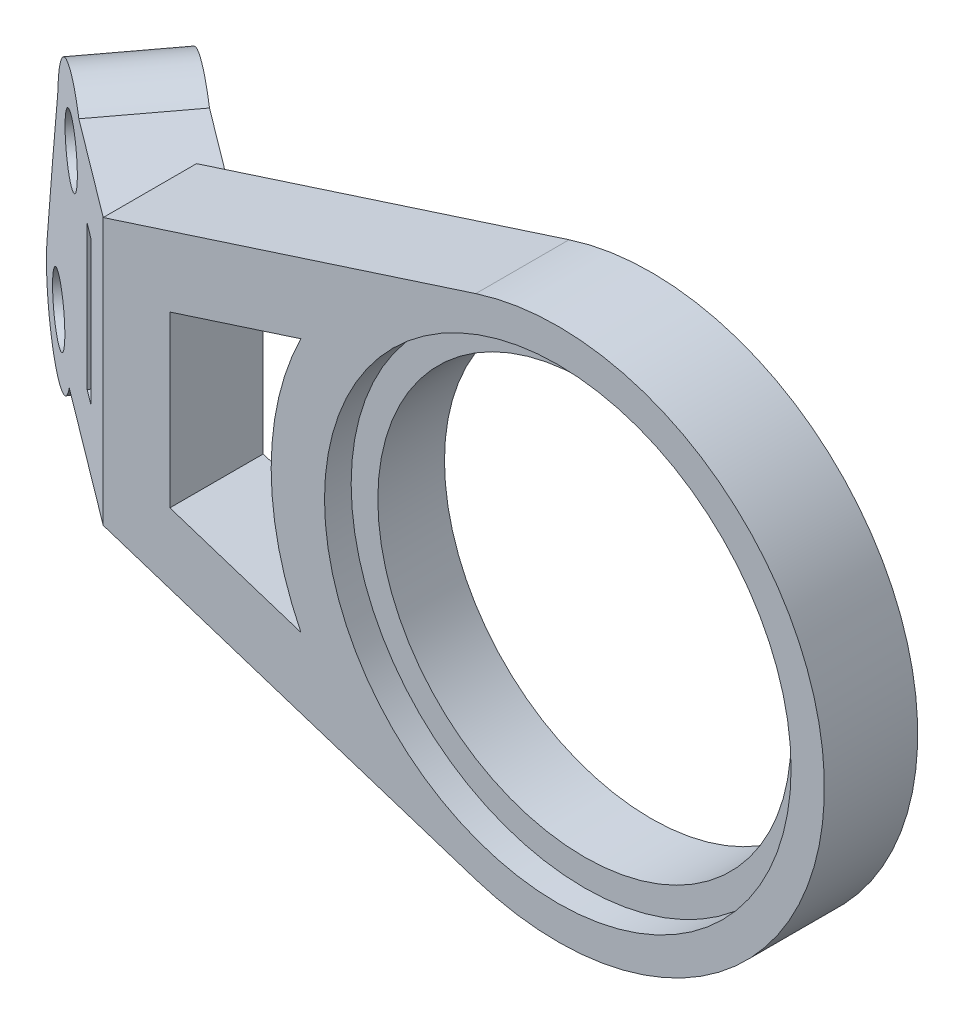
ISO-10303-21;
HEADER;
FILE_DESCRIPTION(('STEP AP214'),'2;1');
FILE_NAME('part.step','',(''),(''),'','','');
FILE_SCHEMA(('AUTOMOTIVE_DESIGN { 1 0 10303 214 1 1 1 1 }'));
ENDSEC;
DATA;
#1=APPLICATION_CONTEXT('core data for automotive mechanical design processes');
#2=APPLICATION_PROTOCOL_DEFINITION('international standard','automotive_design',2000,#1);
#3=PRODUCT_CONTEXT('',#1,'mechanical');
#4=PRODUCT('Part','Part','',(#3));
#5=PRODUCT_RELATED_PRODUCT_CATEGORY('part','',(#4));
#6=PRODUCT_DEFINITION_FORMATION('','',#4);
#7=PRODUCT_DEFINITION_CONTEXT('part definition',#1,'design');
#8=PRODUCT_DEFINITION('design','',#6,#7);
#9=PRODUCT_DEFINITION_SHAPE('','',#8);
#10=(LENGTH_UNIT() NAMED_UNIT(*) SI_UNIT(.MILLI.,.METRE.));
#11=(NAMED_UNIT(*) PLANE_ANGLE_UNIT() SI_UNIT($,.RADIAN.));
#12=(NAMED_UNIT(*) SI_UNIT($,.STERADIAN.) SOLID_ANGLE_UNIT());
#13=UNCERTAINTY_MEASURE_WITH_UNIT(LENGTH_MEASURE(1.E-05),#10,'distance_accuracy_value','');
#14=(GEOMETRIC_REPRESENTATION_CONTEXT(3) GLOBAL_UNCERTAINTY_ASSIGNED_CONTEXT((#13)) GLOBAL_UNIT_ASSIGNED_CONTEXT((#10,
#11,#12)) REPRESENTATION_CONTEXT('',''));
#15=CARTESIAN_POINT('',(0.,0.,0.));
#16=DIRECTION('',(0.,0.,1.));
#17=DIRECTION('',(1.,0.,0.));
#18=AXIS2_PLACEMENT_3D('',#15,#16,#17);
#19=CARTESIAN_POINT('',(0.,-5.,0.));
#20=DIRECTION('',(0.,-1.,0.));
#21=DIRECTION('',(0.,0.,-1.));
#22=AXIS2_PLACEMENT_3D('',#19,#20,#21);
#23=PLANE('',#22);
#24=DIRECTION('',(0.799799289354779,0.,0.600267520983429));
#25=VECTOR('',#24,1.);
#26=CARTESIAN_POINT('',(-17.0487651334141,-5.,3.5));
#27=LINE('',#26,#25);
#28=CARTESIAN_POINT('',(-22.1503316115981,-5.,-0.328841440284535));
#29=VERTEX_POINT('',#28);
#30=CARTESIAN_POINT('',(-17.0487651334141,-5.,3.5));
#31=VERTEX_POINT('',#30);
#32=EDGE_CURVE('E237',#29,#31,#27,.T.);
#33=ORIENTED_EDGE('',*,*,#32,.F.);
#34=DIRECTION('',(-0.600267520983429,0.,0.799799289354779));
#35=VECTOR('',#34,1.);
#36=CARTESIAN_POINT('',(-20.0493952881561,-5.,-3.12813895302626));
#37=LINE('',#36,#35);
#38=CARTESIAN_POINT('',(-20.0493952881561,-5.,-3.12813895302626));
#39=VERTEX_POINT('',#38);
#40=EDGE_CURVE('E180',#39,#29,#37,.T.);
#41=ORIENTED_EDGE('',*,*,#40,.F.);
#42=DIRECTION('',(-0.799799289354779,0.,-0.600267520983429));
#43=VECTOR('',#42,1.);
#44=CARTESIAN_POINT('',(-15.8814481243072,-5.,0.));
#45=LINE('',#44,#43);
#46=CARTESIAN_POINT('',(-15.8814481243072,-5.,0.));
#47=VERTEX_POINT('',#46);
#48=EDGE_CURVE('E234',#47,#39,#45,.T.);
#49=ORIENTED_EDGE('',*,*,#48,.F.);
#50=DIRECTION('',(-1.,0.,0.));
#51=VECTOR('',#50,1.);
#52=CARTESIAN_POINT('',(0.,-5.,0.));
#53=LINE('',#52,#51);
#54=CARTESIAN_POINT('',(-17.0487651334141,-5.,0.));
#55=VERTEX_POINT('',#54);
#56=EDGE_CURVE('E244',#47,#55,#53,.T.);
#57=ORIENTED_EDGE('',*,*,#56,.T.);
#58=DIRECTION('',(0.,0.,-1.));
#59=VECTOR('',#58,1.);
#60=CARTESIAN_POINT('',(-17.0487651334141,-5.,3.5));
#61=LINE('',#60,#59);
#62=EDGE_CURVE('E311',#31,#55,#61,.T.);
#63=ORIENTED_EDGE('',*,*,#62,.F.);
#64=EDGE_LOOP('',(#33,#41,#49,#57,#63));
#65=FACE_BOUND('',#64,.T.);
#66=ADVANCED_FACE('F32',(#65),#23,.T.);
#67=CARTESIAN_POINT('',(0.,0.,0.));
#68=DIRECTION('',(0.,0.,-1.));
#69=DIRECTION('',(-1.,0.,0.));
#70=AXIS2_PLACEMENT_3D('',#67,#68,#69);
#71=PLANE('',#70);
#72=CARTESIAN_POINT('',(0.,0.,0.));
#73=DIRECTION('',(0.,0.,1.));
#74=DIRECTION('',(1.,0.,0.));
#75=AXIS2_PLACEMENT_3D('',#72,#73,#74);
#76=CIRCLE('',#75,7.75);
#77=CARTESIAN_POINT('',(7.75,0.,0.));
#78=VERTEX_POINT('',#77);
#79=EDGE_CURVE('E286',#78,#78,#76,.T.);
#80=ORIENTED_EDGE('',*,*,#79,.T.);
#81=EDGE_LOOP('',(#80));
#82=FACE_BOUND('',#81,.T.);
#83=CARTESIAN_POINT('',(0.,0.,0.));
#84=DIRECTION('',(0.,0.,-1.));
#85=DIRECTION('',(1.,0.,0.));
#86=AXIS2_PLACEMENT_3D('',#83,#84,#85);
#87=CIRCLE('',#86,10.75);
#88=CARTESIAN_POINT('',(-9.63448380999815,-4.76856600194267,0.));
#89=VERTEX_POINT('',#88);
#90=CARTESIAN_POINT('',(-9.63448380999815,4.76856600194267,0.));
#91=VERTEX_POINT('',#90);
#92=EDGE_CURVE('E258',#89,#91,#87,.T.);
#93=ORIENTED_EDGE('',*,*,#92,.T.);
#94=DIRECTION('',(-0.951553015663071,-0.307484728698052,0.));
#95=VECTOR('',#94,1.);
#96=CARTESIAN_POINT('',(-9.63448380999815,4.76856600194266,0.));
#97=LINE('',#96,#95);
#98=CARTESIAN_POINT('',(-14.5487651334141,3.18056571756177,0.));
#99=VERTEX_POINT('',#98);
#100=EDGE_CURVE('E266',#91,#99,#97,.T.);
#101=ORIENTED_EDGE('',*,*,#100,.T.);
#102=DIRECTION('',(0.,-1.,0.));
#103=VECTOR('',#102,1.);
#104=CARTESIAN_POINT('',(-14.5487651334141,3.18056571756177,0.));
#105=LINE('',#104,#103);
#106=CARTESIAN_POINT('',(-14.5487651334141,-3.18056571756177,0.));
#107=VERTEX_POINT('',#106);
#108=EDGE_CURVE('E269',#99,#107,#105,.T.);
#109=ORIENTED_EDGE('',*,*,#108,.T.);
#110=DIRECTION('',(0.951553015663071,-0.307484728698052,0.));
#111=VECTOR('',#110,1.);
#112=CARTESIAN_POINT('',(-14.5487651334141,-3.18056571756177,0.));
#113=LINE('',#112,#111);
#114=EDGE_CURVE('E272',#107,#89,#113,.T.);
#115=ORIENTED_EDGE('',*,*,#114,.T.);
#116=EDGE_LOOP('',(#93,#101,#109,#115));
#117=FACE_BOUND('',#116,.T.);
#118=DIRECTION('',(0.,-1.,0.));
#119=VECTOR('',#118,1.);
#120=CARTESIAN_POINT('',(-15.8814481243072,5.,0.));
#121=LINE('',#120,#119);
#122=CARTESIAN_POINT('',(-15.8814481243072,5.,0.));
#123=VERTEX_POINT('',#122);
#124=EDGE_CURVE('E239',#123,#47,#121,.T.);
#125=ORIENTED_EDGE('',*,*,#124,.F.);
#126=DIRECTION('',(-1.,0.,0.));
#127=VECTOR('',#126,1.);
#128=CARTESIAN_POINT('',(0.,5.,0.));
#129=LINE('',#128,#127);
#130=CARTESIAN_POINT('',(-17.0487651334141,5.,0.));
#131=VERTEX_POINT('',#130);
#132=EDGE_CURVE('E246',#123,#131,#129,.T.);
#133=ORIENTED_EDGE('',*,*,#132,.T.);
#134=DIRECTION('',(-0.951553015663071,-0.307484728698053,0.));
#135=VECTOR('',#134,1.);
#136=CARTESIAN_POINT('',(-3.07484728698053,9.51553015663071,0.));
#137=LINE('',#136,#135);
#138=CARTESIAN_POINT('',(-3.07484728698053,9.51553015663071,0.));
#139=VERTEX_POINT('',#138);
#140=EDGE_CURVE('E305',#139,#131,#137,.T.);
#141=ORIENTED_EDGE('',*,*,#140,.F.);
#142=CARTESIAN_POINT('',(0.,0.,0.));
#143=DIRECTION('',(0.,0.,1.));
#144=DIRECTION('',(-1.,0.,0.));
#145=AXIS2_PLACEMENT_3D('',#142,#143,#144);
#146=CIRCLE('',#145,10.);
#147=CARTESIAN_POINT('',(-3.07484728698053,-9.51553015663071,0.));
#148=VERTEX_POINT('',#147);
#149=EDGE_CURVE('E289',#148,#139,#146,.T.);
#150=ORIENTED_EDGE('',*,*,#149,.F.);
#151=DIRECTION('',(0.951553015663071,-0.307484728698053,0.));
#152=VECTOR('',#151,1.);
#153=CARTESIAN_POINT('',(-3.07484728698053,-9.51553015663071,0.));
#154=LINE('',#153,#152);
#155=EDGE_CURVE('E294',#55,#148,#154,.T.);
#156=ORIENTED_EDGE('',*,*,#155,.F.);
#157=ORIENTED_EDGE('',*,*,#56,.F.);
#158=EDGE_LOOP('',(#125,#133,#141,#150,#156,#157));
#159=FACE_BOUND('',#158,.T.);
#160=ADVANCED_FACE('F320',(#82,#117,#159),#71,.T.);
#161=CARTESIAN_POINT('',(0.,0.,3.5));
#162=DIRECTION('',(0.,0.,-1.));
#163=DIRECTION('',(-1.,0.,0.));
#164=AXIS2_PLACEMENT_3D('',#161,#162,#163);
#165=CYLINDRICAL_SURFACE('',#164,7.75);
#166=ORIENTED_EDGE('',*,*,#79,.F.);
#167=EDGE_LOOP('',(#166));
#168=FACE_BOUND('',#167,.T.);
#169=CARTESIAN_POINT('',(0.,0.,2.5));
#170=DIRECTION('',(0.,0.,1.));
#171=DIRECTION('',(1.,0.,0.));
#172=AXIS2_PLACEMENT_3D('',#169,#170,#171);
#173=CIRCLE('',#172,7.75);
#174=CARTESIAN_POINT('',(7.75,0.,2.5));
#175=VERTEX_POINT('',#174);
#176=EDGE_CURVE('E36',#175,#175,#173,.T.);
#177=ORIENTED_EDGE('',*,*,#176,.T.);
#178=EDGE_LOOP('',(#177));
#179=FACE_BOUND('',#178,.T.);
#180=ADVANCED_FACE('F377',(#168,#179),#165,.F.);
#181=CARTESIAN_POINT('',(0.,0.,3.5));
#182=DIRECTION('',(0.,0.,-1.));
#183=DIRECTION('',(-1.,0.,0.));
#184=AXIS2_PLACEMENT_3D('',#181,#182,#183);
#185=PLANE('',#184);
#186=CARTESIAN_POINT('',(0.,0.,3.5));
#187=DIRECTION('',(0.,0.,1.));
#188=DIRECTION('',(1.,0.,0.));
#189=AXIS2_PLACEMENT_3D('',#186,#187,#188);
#190=CIRCLE('',#189,8.75);
#191=CARTESIAN_POINT('',(8.75,0.,3.5));
#192=VERTEX_POINT('',#191);
#193=EDGE_CURVE('E249',#192,#192,#190,.T.);
#194=ORIENTED_EDGE('',*,*,#193,.F.);
#195=EDGE_LOOP('',(#194));
#196=FACE_BOUND('',#195,.T.);
#197=CARTESIAN_POINT('',(0.,0.,3.5));
#198=DIRECTION('',(0.,0.,1.));
#199=DIRECTION('',(-1.,0.,0.));
#200=AXIS2_PLACEMENT_3D('',#197,#198,#199);
#201=CIRCLE('',#200,10.);
#202=CARTESIAN_POINT('',(-3.07484728698053,-9.51553015663071,3.5));
#203=VERTEX_POINT('',#202);
#204=CARTESIAN_POINT('',(-3.07484728698053,9.51553015663071,3.5));
#205=VERTEX_POINT('',#204);
#206=EDGE_CURVE('E290',#203,#205,#201,.T.);
#207=ORIENTED_EDGE('',*,*,#206,.T.);
#208=DIRECTION('',(-0.951553015663071,-0.307484728698053,0.));
#209=VECTOR('',#208,1.);
#210=CARTESIAN_POINT('',(-3.07484728698053,9.51553015663071,3.5));
#211=LINE('',#210,#209);
#212=CARTESIAN_POINT('',(-17.0487651334141,5.,3.5));
#213=VERTEX_POINT('',#212);
#214=EDGE_CURVE('E293',#205,#213,#211,.T.);
#215=ORIENTED_EDGE('',*,*,#214,.T.);
#216=DIRECTION('',(0.,-1.,0.));
#217=VECTOR('',#216,1.);
#218=CARTESIAN_POINT('',(-17.0487651334141,5.,3.5));
#219=LINE('',#218,#217);
#220=EDGE_CURVE('E297',#213,#31,#219,.T.);
#221=ORIENTED_EDGE('',*,*,#220,.T.);
#222=DIRECTION('',(0.951553015663071,-0.307484728698053,0.));
#223=VECTOR('',#222,1.);
#224=CARTESIAN_POINT('',(-3.07484728698053,-9.51553015663071,3.5));
#225=LINE('',#224,#223);
#226=EDGE_CURVE('E300',#31,#203,#225,.T.);
#227=ORIENTED_EDGE('',*,*,#226,.T.);
#228=EDGE_LOOP('',(#207,#215,#221,#227));
#229=FACE_BOUND('',#228,.T.);
#230=DIRECTION('',(-0.951553015663071,-0.307484728698052,0.));
#231=VECTOR('',#230,1.);
#232=CARTESIAN_POINT('',(-9.63448380999815,4.76856600194266,3.5));
#233=LINE('',#232,#231);
#234=CARTESIAN_POINT('',(-9.63448380999815,4.76856600194267,3.5));
#235=VERTEX_POINT('',#234);
#236=CARTESIAN_POINT('',(-14.5487651334141,3.18056571756177,3.5));
#237=VERTEX_POINT('',#236);
#238=EDGE_CURVE('E255',#235,#237,#233,.T.);
#239=ORIENTED_EDGE('',*,*,#238,.F.);
#240=CARTESIAN_POINT('',(0.,0.,3.5));
#241=DIRECTION('',(0.,0.,-1.));
#242=DIRECTION('',(1.,0.,0.));
#243=AXIS2_PLACEMENT_3D('',#240,#241,#242);
#244=CIRCLE('',#243,10.75);
#245=CARTESIAN_POINT('',(-9.63448380999815,-4.76856600194267,3.5));
#246=VERTEX_POINT('',#245);
#247=EDGE_CURVE('E263',#246,#235,#244,.T.);
#248=ORIENTED_EDGE('',*,*,#247,.F.);
#249=DIRECTION('',(0.951553015663071,-0.307484728698052,0.));
#250=VECTOR('',#249,1.);
#251=CARTESIAN_POINT('',(-14.5487651334141,-3.18056571756177,3.5));
#252=LINE('',#251,#250);
#253=CARTESIAN_POINT('',(-14.5487651334141,-3.18056571756177,3.5));
#254=VERTEX_POINT('',#253);
#255=EDGE_CURVE('E260',#254,#246,#252,.T.);
#256=ORIENTED_EDGE('',*,*,#255,.F.);
#257=DIRECTION('',(0.,-1.,0.));
#258=VECTOR('',#257,1.);
#259=CARTESIAN_POINT('',(-14.5487651334141,3.18056571756177,3.5));
#260=LINE('',#259,#258);
#261=EDGE_CURVE('E257',#237,#254,#260,.T.);
#262=ORIENTED_EDGE('',*,*,#261,.F.);
#263=EDGE_LOOP('',(#239,#248,#256,#262));
#264=FACE_BOUND('',#263,.T.);
#265=ADVANCED_FACE('F337',(#196,#229,#264),#185,.F.);
#266=CARTESIAN_POINT('',(0.,0.,3.5));
#267=DIRECTION('',(0.,0.,-1.));
#268=DIRECTION('',(-1.,0.,0.));
#269=AXIS2_PLACEMENT_3D('',#266,#267,#268);
#270=CYLINDRICAL_SURFACE('',#269,10.);
#271=ORIENTED_EDGE('',*,*,#149,.T.);
#272=DIRECTION('',(0.,0.,-1.));
#273=VECTOR('',#272,1.);
#274=CARTESIAN_POINT('',(-3.07484728698053,9.51553015663071,3.5));
#275=LINE('',#274,#273);
#276=EDGE_CURVE('E11',#205,#139,#275,.T.);
#277=ORIENTED_EDGE('',*,*,#276,.F.);
#278=ORIENTED_EDGE('',*,*,#206,.F.);
#279=DIRECTION('',(0.,0.,-1.));
#280=VECTOR('',#279,1.);
#281=CARTESIAN_POINT('',(-3.07484728698053,-9.51553015663071,3.5));
#282=LINE('',#281,#280);
#283=EDGE_CURVE('E302',#203,#148,#282,.T.);
#284=ORIENTED_EDGE('',*,*,#283,.T.);
#285=EDGE_LOOP('',(#271,#277,#278,#284));
#286=FACE_BOUND('',#285,.T.);
#287=ADVANCED_FACE('F34',(#286),#270,.T.);
#288=CARTESIAN_POINT('',(-3.07484728698053,9.51553015663071,3.5));
#289=DIRECTION('',(0.307484728698053,-0.951553015663071,0.));
#290=DIRECTION('',(0.951553015663071,0.307484728698053,0.));
#291=AXIS2_PLACEMENT_3D('',#288,#289,#290);
#292=PLANE('',#291);
#293=ORIENTED_EDGE('',*,*,#140,.T.);
#294=DIRECTION('',(0.,0.,-1.));
#295=VECTOR('',#294,1.);
#296=CARTESIAN_POINT('',(-17.0487651334141,5.,3.5));
#297=LINE('',#296,#295);
#298=EDGE_CURVE('E41',#213,#131,#297,.T.);
#299=ORIENTED_EDGE('',*,*,#298,.F.);
#300=ORIENTED_EDGE('',*,*,#214,.F.);
#301=ORIENTED_EDGE('',*,*,#276,.T.);
#302=EDGE_LOOP('',(#293,#299,#300,#301));
#303=FACE_BOUND('',#302,.T.);
#304=ADVANCED_FACE('F323',(#303),#292,.F.);
#305=CARTESIAN_POINT('',(-3.07484728698053,-9.51553015663071,3.5));
#306=DIRECTION('',(0.307484728698053,0.951553015663071,0.));
#307=DIRECTION('',(-0.951553015663071,0.307484728698053,0.));
#308=AXIS2_PLACEMENT_3D('',#305,#306,#307);
#309=PLANE('',#308);
#310=ORIENTED_EDGE('',*,*,#155,.T.);
#311=ORIENTED_EDGE('',*,*,#283,.F.);
#312=ORIENTED_EDGE('',*,*,#226,.F.);
#313=ORIENTED_EDGE('',*,*,#62,.T.);
#314=EDGE_LOOP('',(#310,#311,#312,#313));
#315=FACE_BOUND('',#314,.T.);
#316=ADVANCED_FACE('F330',(#315),#309,.F.);
#317=CARTESIAN_POINT('',(-9.63448380999815,4.76856600194266,3.5));
#318=DIRECTION('',(0.307484728698052,-0.951553015663071,0.));
#319=DIRECTION('',(0.951553015663071,0.307484728698052,0.));
#320=AXIS2_PLACEMENT_3D('',#317,#318,#319);
#321=PLANE('',#320);
#322=ORIENTED_EDGE('',*,*,#100,.F.);
#323=DIRECTION('',(0.,0.,-1.));
#324=VECTOR('',#323,1.);
#325=CARTESIAN_POINT('',(-9.63448380999815,4.76856600194267,3.5));
#326=LINE('',#325,#324);
#327=EDGE_CURVE('E265',#235,#91,#326,.T.);
#328=ORIENTED_EDGE('',*,*,#327,.F.);
#329=ORIENTED_EDGE('',*,*,#238,.T.);
#330=DIRECTION('',(0.,0.,-1.));
#331=VECTOR('',#330,1.);
#332=CARTESIAN_POINT('',(-14.5487651334141,3.18056571756177,3.5));
#333=LINE('',#332,#331);
#334=EDGE_CURVE('E283',#237,#99,#333,.T.);
#335=ORIENTED_EDGE('',*,*,#334,.T.);
#336=EDGE_LOOP('',(#322,#328,#329,#335));
#337=FACE_BOUND('',#336,.T.);
#338=ADVANCED_FACE('F407',(#337),#321,.T.);
#339=CARTESIAN_POINT('',(-14.5487651334141,3.18056571756177,3.5));
#340=DIRECTION('',(1.,0.,0.));
#341=DIRECTION('',(0.,0.,-1.));
#342=AXIS2_PLACEMENT_3D('',#339,#340,#341);
#343=PLANE('',#342);
#344=ORIENTED_EDGE('',*,*,#108,.F.);
#345=ORIENTED_EDGE('',*,*,#334,.F.);
#346=ORIENTED_EDGE('',*,*,#261,.T.);
#347=DIRECTION('',(0.,0.,-1.));
#348=VECTOR('',#347,1.);
#349=CARTESIAN_POINT('',(-14.5487651334141,-3.18056571756177,3.5));
#350=LINE('',#349,#348);
#351=EDGE_CURVE('E281',#254,#107,#350,.T.);
#352=ORIENTED_EDGE('',*,*,#351,.T.);
#353=EDGE_LOOP('',(#344,#345,#346,#352));
#354=FACE_BOUND('',#353,.T.);
#355=ADVANCED_FACE('F403',(#354),#343,.T.);
#356=CARTESIAN_POINT('',(-14.5487651334141,-3.18056571756177,3.5));
#357=DIRECTION('',(0.307484728698053,0.951553015663071,0.));
#358=DIRECTION('',(-0.951553015663071,0.307484728698053,0.));
#359=AXIS2_PLACEMENT_3D('',#356,#357,#358);
#360=PLANE('',#359);
#361=ORIENTED_EDGE('',*,*,#114,.F.);
#362=ORIENTED_EDGE('',*,*,#351,.F.);
#363=ORIENTED_EDGE('',*,*,#255,.T.);
#364=DIRECTION('',(0.,0.,-1.));
#365=VECTOR('',#364,1.);
#366=CARTESIAN_POINT('',(-9.63448380999815,-4.76856600194267,3.5));
#367=LINE('',#366,#365);
#368=EDGE_CURVE('E279',#246,#89,#367,.T.);
#369=ORIENTED_EDGE('',*,*,#368,.T.);
#370=EDGE_LOOP('',(#361,#362,#363,#369));
#371=FACE_BOUND('',#370,.T.);
#372=ADVANCED_FACE('F399',(#371),#360,.T.);
#373=CARTESIAN_POINT('',(0.,0.,3.5));
#374=DIRECTION('',(0.,0.,-1.));
#375=DIRECTION('',(-1.,0.,0.));
#376=AXIS2_PLACEMENT_3D('',#373,#374,#375);
#377=CYLINDRICAL_SURFACE('',#376,10.75);
#378=ORIENTED_EDGE('',*,*,#92,.F.);
#379=ORIENTED_EDGE('',*,*,#368,.F.);
#380=ORIENTED_EDGE('',*,*,#247,.T.);
#381=ORIENTED_EDGE('',*,*,#327,.T.);
#382=EDGE_LOOP('',(#378,#379,#380,#381));
#383=FACE_BOUND('',#382,.T.);
#384=ADVANCED_FACE('F395',(#383),#377,.T.);
#385=CARTESIAN_POINT('',(0.,0.,2.5));
#386=DIRECTION('',(0.,0.,1.));
#387=DIRECTION('',(1.,0.,0.));
#388=AXIS2_PLACEMENT_3D('',#385,#386,#387);
#389=CYLINDRICAL_SURFACE('',#388,8.75);
#390=CARTESIAN_POINT('',(0.,0.,2.5));
#391=DIRECTION('',(0.,0.,1.));
#392=DIRECTION('',(1.,0.,0.));
#393=AXIS2_PLACEMENT_3D('',#390,#391,#392);
#394=CIRCLE('',#393,8.75);
#395=CARTESIAN_POINT('',(8.75,0.,2.5));
#396=VERTEX_POINT('',#395);
#397=EDGE_CURVE('E250',#396,#396,#394,.T.);
#398=ORIENTED_EDGE('',*,*,#397,.F.);
#399=EDGE_LOOP('',(#398));
#400=FACE_BOUND('',#399,.T.);
#401=ORIENTED_EDGE('',*,*,#193,.T.);
#402=EDGE_LOOP('',(#401));
#403=FACE_BOUND('',#402,.T.);
#404=ADVANCED_FACE('F391',(#400,#403),#389,.F.);
#405=CARTESIAN_POINT('',(0.,0.,2.5));
#406=DIRECTION('',(0.,0.,1.));
#407=DIRECTION('',(1.,0.,0.));
#408=AXIS2_PLACEMENT_3D('',#405,#406,#407);
#409=PLANE('',#408);
#410=ORIENTED_EDGE('',*,*,#176,.F.);
#411=EDGE_LOOP('',(#410));
#412=FACE_BOUND('',#411,.T.);
#413=ORIENTED_EDGE('',*,*,#397,.T.);
#414=EDGE_LOOP('',(#413));
#415=FACE_BOUND('',#414,.T.);
#416=ADVANCED_FACE('F388',(#412,#415),#409,.T.);
#417=CARTESIAN_POINT('',(-15.8814481243072,5.,0.));
#418=DIRECTION('',(-0.600267520983429,0.,0.799799289354779));
#419=DIRECTION('',(0.799799289354779,0.,0.600267520983429));
#420=AXIS2_PLACEMENT_3D('',#417,#418,#419);
#421=PLANE('',#420);
#422=CARTESIAN_POINT('',(-21.642482243929,-3.85,-4.32378687417455));
#423=DIRECTION('',(-0.600267520983429,0.,0.799799289354779));
#424=DIRECTION('',(0.799799289354779,0.,0.600267520983429));
#425=AXIS2_PLACEMENT_3D('',#422,#423,#424);
#426=CIRCLE('',#425,1.15);
#427=CARTESIAN_POINT('',(-20.722713061171,-3.85,-3.63347922504361));
#428=VERTEX_POINT('',#427);
#429=EDGE_CURVE('E196',#428,#428,#426,.T.);
#430=ORIENTED_EDGE('',*,*,#429,.T.);
#431=EDGE_LOOP('',(#430));
#432=FACE_BOUND('',#431,.T.);
#433=CARTESIAN_POINT('',(-19.7629539139453,2.95569614367259,-2.91315819986349));
#434=DIRECTION('',(-0.600267520983429,0.,0.799799289354779));
#435=DIRECTION('',(0.799799289354779,0.,0.600267520983429));
#436=AXIS2_PLACEMENT_3D('',#433,#434,#435);
#437=CIRCLE('',#436,1.14999999999999);
#438=CARTESIAN_POINT('',(-18.8431847311873,2.95569614367259,-2.22285055073255));
#439=VERTEX_POINT('',#438);
#440=EDGE_CURVE('E351',#439,#439,#437,.T.);
#441=ORIENTED_EDGE('',*,*,#440,.T.);
#442=EDGE_LOOP('',(#441));
#443=FACE_BOUND('',#442,.T.);
#444=DIRECTION('',(0.254846678052839,0.947876384359618,0.19126821654099));
#445=VECTOR('',#444,1.);
#446=CARTESIAN_POINT('',(-22.5622514266871,0.159821910403786,-5.01409452330543));
#447=LINE('',#446,#445);
#448=CARTESIAN_POINT('',(-22.5622514266871,0.159821910403786,-5.01409452330543));
#449=VERTEX_POINT('',#448);
#450=CARTESIAN_POINT('',(-21.7558101411383,3.15929852035892,-4.40884203341443));
#451=VERTEX_POINT('',#450);
#452=EDGE_CURVE('E159',#449,#451,#447,.T.);
#453=ORIENTED_EDGE('',*,*,#452,.T.);
#454=CARTESIAN_POINT('',(-19.7629539139453,2.95569614367259,-2.91315819986343));
#455=DIRECTION('',(-0.600267520983429,0.,0.799799289354779));
#456=DIRECTION('',(0.799799289354779,0.,0.600267520983429));
#457=AXIS2_PLACEMENT_3D('',#454,#455,#456);
#458=CIRCLE('',#457,2.5);
#459=CARTESIAN_POINT('',(-18.6120147403151,5.,-2.04935222534822));
#460=VERTEX_POINT('',#459);
#461=EDGE_CURVE('E187',#460,#451,#458,.T.);
#462=ORIENTED_EDGE('',*,*,#461,.F.);
#463=DIRECTION('',(-0.799799289354779,0.,-0.600267520983429));
#464=VECTOR('',#463,1.);
#465=CARTESIAN_POINT('',(-15.8814481243072,5.,0.));
#466=LINE('',#465,#464);
#467=EDGE_CURVE('E48',#123,#460,#466,.T.);
#468=ORIENTED_EDGE('',*,*,#467,.F.);
#469=ORIENTED_EDGE('',*,*,#124,.T.);
#470=ORIENTED_EDGE('',*,*,#48,.T.);
#471=CARTESIAN_POINT('',(-21.6424822439291,-3.85,-4.32378687417449));
#472=DIRECTION('',(0.600267520983429,0.,-0.799799289354779));
#473=DIRECTION('',(-0.799799289354779,0.,-0.600267520983429));
#474=AXIS2_PLACEMENT_3D('',#471,#472,#473);
#475=CIRCLE('',#474,2.3);
#476=CARTESIAN_POINT('',(-23.3972863012814,-3.15998528187295,-5.64080715080954));
#477=VERTEX_POINT('',#476);
#478=EDGE_CURVE('E185',#39,#477,#475,.T.);
#479=ORIENTED_EDGE('',*,*,#478,.T.);
#480=DIRECTION('',(-0.239944904870587,-0.953937188942567,-0.180084097518349));
#481=VECTOR('',#480,1.);
#482=CARTESIAN_POINT('',(-21.6703496284588,3.70571214163678,-4.34470197881457));
#483=LINE('',#482,#481);
#484=EDGE_CURVE('E176',#449,#477,#483,.T.);
#485=ORIENTED_EDGE('',*,*,#484,.F.);
#486=EDGE_LOOP('',(#453,#462,#468,#469,#470,#479,#485));
#487=FACE_BOUND('',#486,.T.);
#488=DIRECTION('',(-0.799799289354779,0.,-0.600267520983429));
#489=VECTOR('',#488,1.);
#490=CARTESIAN_POINT('',(-15.8814481243072,2.7,0.));
#491=LINE('',#490,#489);
#492=CARTESIAN_POINT('',(-16.787367175488,2.7,-0.679912811003675));
#493=VERTEX_POINT('',#492);
#494=CARTESIAN_POINT('',(-17.363556045881,2.7,-1.11235563691321));
#495=VERTEX_POINT('',#494);
#496=EDGE_CURVE('E228',#493,#495,#491,.T.);
#497=ORIENTED_EDGE('',*,*,#496,.T.);
#498=DIRECTION('',(0.,-1.,0.));
#499=VECTOR('',#498,1.);
#500=CARTESIAN_POINT('',(-17.363556045881,5.,-1.11235563691321));
#501=LINE('',#500,#499);
#502=CARTESIAN_POINT('',(-17.363556045881,-2.7,-1.11235563691321));
#503=VERTEX_POINT('',#502);
#504=EDGE_CURVE('E231',#495,#503,#501,.T.);
#505=ORIENTED_EDGE('',*,*,#504,.T.);
#506=DIRECTION('',(0.799799289354779,0.,0.600267520983429));
#507=VECTOR('',#506,1.);
#508=CARTESIAN_POINT('',(-15.8814481243072,-2.7,0.));
#509=LINE('',#508,#507);
#510=CARTESIAN_POINT('',(-16.787367175488,-2.7,-0.679912811003675));
#511=VERTEX_POINT('',#510);
#512=EDGE_CURVE('E216',#503,#511,#509,.T.);
#513=ORIENTED_EDGE('',*,*,#512,.T.);
#514=DIRECTION('',(0.,1.,0.));
#515=VECTOR('',#514,1.);
#516=CARTESIAN_POINT('',(-16.787367175488,5.,-0.679912811003676));
#517=LINE('',#516,#515);
#518=EDGE_CURVE('E225',#511,#493,#517,.T.);
#519=ORIENTED_EDGE('',*,*,#518,.T.);
#520=EDGE_LOOP('',(#497,#505,#513,#519));
#521=FACE_BOUND('',#520,.T.);
#522=ADVANCED_FACE('F182',(#432,#443,#487,#521),#421,.F.);
#523=CARTESIAN_POINT('',(-17.0487651334141,5.,3.5));
#524=DIRECTION('',(0.600267520983429,0.,-0.799799289354779));
#525=DIRECTION('',(-0.799799289354779,0.,-0.600267520983429));
#526=AXIS2_PLACEMENT_3D('',#523,#524,#525);
#527=PLANE('',#526);
#528=CARTESIAN_POINT('',(-23.7434185673711,-3.85,-1.52448936143276));
#529=DIRECTION('',(-0.600267520983429,0.,0.799799289354779));
#530=DIRECTION('',(0.799799289354779,0.,0.600267520983429));
#531=AXIS2_PLACEMENT_3D('',#528,#529,#530);
#532=CIRCLE('',#531,1.15);
#533=CARTESIAN_POINT('',(-22.8236493846131,-3.85,-0.83418171230182));
#534=VERTEX_POINT('',#533);
#535=EDGE_CURVE('E348',#534,#534,#532,.T.);
#536=ORIENTED_EDGE('',*,*,#535,.F.);
#537=EDGE_LOOP('',(#536));
#538=FACE_BOUND('',#537,.T.);
#539=CARTESIAN_POINT('',(-21.8638902373873,2.95569614367259,-0.113860687121705));
#540=DIRECTION('',(-0.600267520983429,0.,0.799799289354779));
#541=DIRECTION('',(0.799799289354779,0.,0.600267520983429));
#542=AXIS2_PLACEMENT_3D('',#539,#540,#541);
#543=CIRCLE('',#542,1.14999999999999);
#544=CARTESIAN_POINT('',(-20.9441210546294,2.95569614367259,0.576446962009234));
#545=VERTEX_POINT('',#544);
#546=EDGE_CURVE('E344',#545,#545,#543,.T.);
#547=ORIENTED_EDGE('',*,*,#546,.F.);
#548=EDGE_LOOP('',(#547));
#549=FACE_BOUND('',#548,.T.);
#550=CARTESIAN_POINT('',(-21.8638902373873,2.95569614367259,-0.113860687121705));
#551=DIRECTION('',(-0.600267520983429,0.,0.799799289354779));
#552=DIRECTION('',(0.799799289354779,0.,0.600267520983429));
#553=AXIS2_PLACEMENT_3D('',#550,#551,#552);
#554=CIRCLE('',#553,2.5);
#555=CARTESIAN_POINT('',(-20.7129510637571,5.,0.749945287393567));
#556=VERTEX_POINT('',#555);
#557=CARTESIAN_POINT('',(-23.8567464645803,3.15929852035892,-1.60954452067271));
#558=VERTEX_POINT('',#557);
#559=EDGE_CURVE('E194',#556,#558,#554,.T.);
#560=ORIENTED_EDGE('',*,*,#559,.T.);
#561=DIRECTION('',(0.254846678052839,0.947876384359618,0.19126821654099));
#562=VECTOR('',#561,1.);
#563=CARTESIAN_POINT('',(-24.6631877501291,0.159821910403786,-2.2147970105637));
#564=LINE('',#563,#562);
#565=CARTESIAN_POINT('',(-24.6631877501291,0.159821910403786,-2.2147970105637));
#566=VERTEX_POINT('',#565);
#567=EDGE_CURVE('E170',#566,#558,#564,.T.);
#568=ORIENTED_EDGE('',*,*,#567,.F.);
#569=DIRECTION('',(-0.239944904870587,-0.953937188942567,-0.180084097518349));
#570=VECTOR('',#569,1.);
#571=CARTESIAN_POINT('',(-23.7712859519008,3.70571214163678,-1.54540446607285));
#572=LINE('',#571,#570);
#573=CARTESIAN_POINT('',(-25.4982226247234,-3.15998528187295,-2.84150963806781));
#574=VERTEX_POINT('',#573);
#575=EDGE_CURVE('E178',#566,#574,#572,.T.);
#576=ORIENTED_EDGE('',*,*,#575,.T.);
#577=CARTESIAN_POINT('',(-23.7434185673711,-3.85,-1.52448936143276));
#578=DIRECTION('',(0.600267520983429,0.,-0.799799289354779));
#579=DIRECTION('',(-0.799799289354779,0.,-0.600267520983429));
#580=AXIS2_PLACEMENT_3D('',#577,#578,#579);
#581=CIRCLE('',#580,2.3);
#582=EDGE_CURVE('E56',#29,#574,#581,.T.);
#583=ORIENTED_EDGE('',*,*,#582,.F.);
#584=ORIENTED_EDGE('',*,*,#32,.T.);
#585=ORIENTED_EDGE('',*,*,#220,.F.);
#586=DIRECTION('',(0.799799289354779,0.,0.600267520983429));
#587=VECTOR('',#586,1.);
#588=CARTESIAN_POINT('',(-17.0487651334141,5.,3.5));
#589=LINE('',#588,#587);
#590=EDGE_CURVE('E236',#556,#213,#589,.T.);
#591=ORIENTED_EDGE('',*,*,#590,.F.);
#592=EDGE_LOOP('',(#560,#568,#576,#583,#584,#585,#591));
#593=FACE_BOUND('',#592,.T.);
#594=DIRECTION('',(0.79979928935478,0.,0.600267520983427));
#595=VECTOR('',#594,1.);
#596=CARTESIAN_POINT('',(-19.464492369323,-2.7,1.68694187582858));
#597=LINE('',#596,#595);
#598=CARTESIAN_POINT('',(-19.464492369323,-2.7,1.68694187582858));
#599=VERTEX_POINT('',#598);
#600=CARTESIAN_POINT('',(-18.8883034989301,-2.7,2.11938470173811));
#601=VERTEX_POINT('',#600);
#602=EDGE_CURVE('E204',#599,#601,#597,.T.);
#603=ORIENTED_EDGE('',*,*,#602,.F.);
#604=DIRECTION('',(0.,-1.,0.));
#605=VECTOR('',#604,1.);
#606=CARTESIAN_POINT('',(-19.464492369323,2.7,1.68694187582858));
#607=LINE('',#606,#605);
#608=CARTESIAN_POINT('',(-19.464492369323,2.7,1.68694187582858));
#609=VERTEX_POINT('',#608);
#610=EDGE_CURVE('E179',#609,#599,#607,.T.);
#611=ORIENTED_EDGE('',*,*,#610,.F.);
#612=DIRECTION('',(-0.79979928935478,0.,-0.600267520983427));
#613=VECTOR('',#612,1.);
#614=CARTESIAN_POINT('',(-19.464492369323,2.7,1.68694187582858));
#615=LINE('',#614,#613);
#616=CARTESIAN_POINT('',(-18.8883034989301,2.7,2.11938470173811));
#617=VERTEX_POINT('',#616);
#618=EDGE_CURVE('E210',#617,#609,#615,.T.);
#619=ORIENTED_EDGE('',*,*,#618,.F.);
#620=DIRECTION('',(0.,1.,0.));
#621=VECTOR('',#620,1.);
#622=CARTESIAN_POINT('',(-18.8883034989301,2.7,2.11938470173811));
#623=LINE('',#622,#621);
#624=EDGE_CURVE('E207',#601,#617,#623,.T.);
#625=ORIENTED_EDGE('',*,*,#624,.F.);
#626=EDGE_LOOP('',(#603,#611,#619,#625));
#627=FACE_BOUND('',#626,.T.);
#628=ADVANCED_FACE('F339',(#538,#549,#593,#627),#527,.F.);
#629=CARTESIAN_POINT('',(0.,5.,0.));
#630=DIRECTION('',(0.,-1.,0.));
#631=DIRECTION('',(0.,0.,-1.));
#632=AXIS2_PLACEMENT_3D('',#629,#630,#631);
#633=PLANE('',#632);
#634=ORIENTED_EDGE('',*,*,#467,.T.);
#635=DIRECTION('',(-0.600267520983429,0.,0.799799289354779));
#636=VECTOR('',#635,1.);
#637=CARTESIAN_POINT('',(-18.6120147403151,5.,-2.04935222534816));
#638=LINE('',#637,#636);
#639=EDGE_CURVE('E189',#460,#556,#638,.T.);
#640=ORIENTED_EDGE('',*,*,#639,.T.);
#641=ORIENTED_EDGE('',*,*,#590,.T.);
#642=ORIENTED_EDGE('',*,*,#298,.T.);
#643=ORIENTED_EDGE('',*,*,#132,.F.);
#644=EDGE_LOOP('',(#634,#640,#641,#642,#643));
#645=FACE_BOUND('',#644,.T.);
#646=ADVANCED_FACE('F315',(#645),#633,.F.);
#647=CARTESIAN_POINT('',(-5.63068989924629,2.7,-16.7452820874386));
#648=DIRECTION('',(-0.799799289354779,0.,-0.600267520983429));
#649=DIRECTION('',(-0.600267520983429,0.,0.799799289354779));
#650=AXIS2_PLACEMENT_3D('',#647,#648,#649);
#651=PLANE('',#650);
#652=DIRECTION('',(-0.600267520983429,0.,0.799799289354779));
#653=VECTOR('',#652,1.);
#654=CARTESIAN_POINT('',(-5.63068989924629,2.7,-16.7452820874386));
#655=LINE('',#654,#653);
#656=EDGE_CURVE('E214',#495,#609,#655,.T.);
#657=ORIENTED_EDGE('',*,*,#656,.T.);
#658=ORIENTED_EDGE('',*,*,#610,.T.);
#659=DIRECTION('',(-0.600267520983429,0.,0.799799289354779));
#660=VECTOR('',#659,1.);
#661=CARTESIAN_POINT('',(-5.63068989924629,-2.7,-16.7452820874386));
#662=LINE('',#661,#660);
#663=EDGE_CURVE('E213',#503,#599,#662,.T.);
#664=ORIENTED_EDGE('',*,*,#663,.F.);
#665=ORIENTED_EDGE('',*,*,#504,.F.);
#666=EDGE_LOOP('',(#657,#658,#664,#665));
#667=FACE_BOUND('',#666,.T.);
#668=ADVANCED_FACE('F479',(#667),#651,.F.);
#669=CARTESIAN_POINT('',(-5.63068989924629,2.7,-16.7452820874386));
#670=DIRECTION('',(0.,1.,0.));
#671=DIRECTION('',(0.,0.,1.));
#672=AXIS2_PLACEMENT_3D('',#669,#670,#671);
#673=PLANE('',#672);
#674=DIRECTION('',(-0.600267520983429,0.,0.799799289354779));
#675=VECTOR('',#674,1.);
#676=CARTESIAN_POINT('',(-5.05450102885334,2.7,-16.3128392615291));
#677=LINE('',#676,#675);
#678=EDGE_CURVE('E217',#493,#617,#677,.T.);
#679=ORIENTED_EDGE('',*,*,#678,.T.);
#680=ORIENTED_EDGE('',*,*,#618,.T.);
#681=ORIENTED_EDGE('',*,*,#656,.F.);
#682=ORIENTED_EDGE('',*,*,#496,.F.);
#683=EDGE_LOOP('',(#679,#680,#681,#682));
#684=FACE_BOUND('',#683,.T.);
#685=ADVANCED_FACE('F484',(#684),#673,.F.);
#686=CARTESIAN_POINT('',(-5.05450102885334,2.7,-16.3128392615291));
#687=DIRECTION('',(0.799799289354779,0.,0.600267520983429));
#688=DIRECTION('',(0.600267520983429,0.,-0.799799289354779));
#689=AXIS2_PLACEMENT_3D('',#686,#687,#688);
#690=PLANE('',#689);
#691=DIRECTION('',(-0.600267520983429,0.,0.799799289354779));
#692=VECTOR('',#691,1.);
#693=CARTESIAN_POINT('',(-5.05450102885334,-2.7,-16.3128392615291));
#694=LINE('',#693,#692);
#695=EDGE_CURVE('E219',#511,#601,#694,.T.);
#696=ORIENTED_EDGE('',*,*,#695,.T.);
#697=ORIENTED_EDGE('',*,*,#624,.T.);
#698=ORIENTED_EDGE('',*,*,#678,.F.);
#699=ORIENTED_EDGE('',*,*,#518,.F.);
#700=EDGE_LOOP('',(#696,#697,#698,#699));
#701=FACE_BOUND('',#700,.T.);
#702=ADVANCED_FACE('F495',(#701),#690,.F.);
#703=CARTESIAN_POINT('',(-5.63068989924629,-2.7,-16.7452820874386));
#704=DIRECTION('',(0.,-1.,0.));
#705=DIRECTION('',(0.,0.,-1.));
#706=AXIS2_PLACEMENT_3D('',#703,#704,#705);
#707=PLANE('',#706);
#708=ORIENTED_EDGE('',*,*,#663,.T.);
#709=ORIENTED_EDGE('',*,*,#602,.T.);
#710=ORIENTED_EDGE('',*,*,#695,.F.);
#711=ORIENTED_EDGE('',*,*,#512,.F.);
#712=EDGE_LOOP('',(#708,#709,#710,#711));
#713=FACE_BOUND('',#712,.T.);
#714=ADVANCED_FACE('F505',(#713),#707,.F.);
#715=CARTESIAN_POINT('',(-21.6424822439291,-3.85,-4.32378687417449));
#716=DIRECTION('',(-0.600267520983429,0.,0.799799289354779));
#717=DIRECTION('',(0.799799289354779,0.,0.600267520983429));
#718=AXIS2_PLACEMENT_3D('',#715,#716,#717);
#719=CYLINDRICAL_SURFACE('',#718,2.3);
#720=ORIENTED_EDGE('',*,*,#582,.T.);
#721=DIRECTION('',(-0.600267520983429,0.,0.799799289354779));
#722=VECTOR('',#721,1.);
#723=CARTESIAN_POINT('',(-23.3972863012814,-3.15998528187295,-5.64080715080954));
#724=LINE('',#723,#722);
#725=EDGE_CURVE('E200',#477,#574,#724,.T.);
#726=ORIENTED_EDGE('',*,*,#725,.F.);
#727=ORIENTED_EDGE('',*,*,#478,.F.);
#728=ORIENTED_EDGE('',*,*,#40,.T.);
#729=EDGE_LOOP('',(#720,#726,#727,#728));
#730=FACE_BOUND('',#729,.T.);
#731=ADVANCED_FACE('F514',(#730),#719,.T.);
#732=CARTESIAN_POINT('',(-21.6703496284588,3.70571214163678,-4.34470197881457));
#733=DIRECTION('',(-0.76295828580536,0.300006399185673,-0.572617511580455));
#734=DIRECTION('',(-0.600267520983429,0.,0.799799289354779));
#735=AXIS2_PLACEMENT_3D('',#732,#733,#734);
#736=PLANE('',#735);
#737=DIRECTION('',(-0.600267520983428,0.,0.799799289354779));
#738=VECTOR('',#737,1.);
#739=CARTESIAN_POINT('',(-22.562251426687,0.159821910403788,-5.01409452330549));
#740=LINE('',#739,#738);
#741=EDGE_CURVE('E163',#449,#566,#740,.T.);
#742=ORIENTED_EDGE('',*,*,#741,.F.);
#743=ORIENTED_EDGE('',*,*,#484,.T.);
#744=ORIENTED_EDGE('',*,*,#725,.T.);
#745=ORIENTED_EDGE('',*,*,#575,.F.);
#746=EDGE_LOOP('',(#742,#743,#744,#745));
#747=FACE_BOUND('',#746,.T.);
#748=ADVANCED_FACE('F174',(#747),#736,.T.);
#749=CARTESIAN_POINT('',(-19.7629539139453,2.95569614367259,-2.91315819986343));
#750=DIRECTION('',(-0.600267520983429,0.,0.799799289354779));
#751=DIRECTION('',(0.799799289354779,0.,0.600267520983429));
#752=AXIS2_PLACEMENT_3D('',#749,#750,#751);
#753=CYLINDRICAL_SURFACE('',#752,2.5);
#754=ORIENTED_EDGE('',*,*,#461,.T.);
#755=DIRECTION('',(-0.600267520983429,0.,0.799799289354779));
#756=VECTOR('',#755,1.);
#757=CARTESIAN_POINT('',(-21.7558101411383,3.15929852035892,-4.40884203341443));
#758=LINE('',#757,#756);
#759=EDGE_CURVE('E166',#451,#558,#758,.T.);
#760=ORIENTED_EDGE('',*,*,#759,.T.);
#761=ORIENTED_EDGE('',*,*,#559,.F.);
#762=ORIENTED_EDGE('',*,*,#639,.F.);
#763=EDGE_LOOP('',(#754,#760,#761,#762));
#764=FACE_BOUND('',#763,.T.);
#765=ADVANCED_FACE('F343',(#764),#753,.T.);
#766=CARTESIAN_POINT('',(-7.69867552662466,2.95569614367259,-18.9876598902917));
#767=DIRECTION('',(-0.600267520983429,0.,0.799799289354779));
#768=DIRECTION('',(0.799799289354779,0.,0.600267520983429));
#769=AXIS2_PLACEMENT_3D('',#766,#767,#768);
#770=CYLINDRICAL_SURFACE('',#769,1.14999999999999);
#771=ORIENTED_EDGE('',*,*,#546,.T.);
#772=EDGE_LOOP('',(#771));
#773=FACE_BOUND('',#772,.T.);
#774=ORIENTED_EDGE('',*,*,#440,.F.);
#775=EDGE_LOOP('',(#774));
#776=FACE_BOUND('',#775,.T.);
#777=ADVANCED_FACE('F362',(#773,#776),#770,.F.);
#778=CARTESIAN_POINT('',(-9.57820385660839,-3.85,-20.3982885646027));
#779=DIRECTION('',(-0.600267520983429,0.,0.799799289354779));
#780=DIRECTION('',(0.799799289354779,0.,0.600267520983429));
#781=AXIS2_PLACEMENT_3D('',#778,#779,#780);
#782=CYLINDRICAL_SURFACE('',#781,1.15);
#783=ORIENTED_EDGE('',*,*,#535,.T.);
#784=EDGE_LOOP('',(#783));
#785=FACE_BOUND('',#784,.T.);
#786=ORIENTED_EDGE('',*,*,#429,.F.);
#787=EDGE_LOOP('',(#786));
#788=FACE_BOUND('',#787,.T.);
#789=ADVANCED_FACE('F360',(#785,#788),#782,.F.);
#790=CARTESIAN_POINT('',(-22.5622514266871,0.159821910403786,-5.01409452330543));
#791=DIRECTION('',(0.758110858606999,-0.318638290187068,0.568979407438283));
#792=DIRECTION('',(0.600267520983429,0.,-0.799799289354779));
#793=AXIS2_PLACEMENT_3D('',#790,#791,#792);
#794=PLANE('',#793);
#795=ORIENTED_EDGE('',*,*,#567,.T.);
#796=ORIENTED_EDGE('',*,*,#759,.F.);
#797=ORIENTED_EDGE('',*,*,#452,.F.);
#798=ORIENTED_EDGE('',*,*,#741,.T.);
#799=EDGE_LOOP('',(#795,#796,#797,#798));
#800=FACE_BOUND('',#799,.T.);
#801=ADVANCED_FACE('F162',(#800),#794,.F.);
#802=CLOSED_SHELL('',(#66,#160,#180,#265,#287,#304,#316,#338,#355,#372,#384,#404,#416,#522,#628,
#646,#668,#685,#702,#714,#731,#748,#765,#777,#789,#801));
#803=MANIFOLD_SOLID_BREP('B2',#802);
#804=ADVANCED_BREP_SHAPE_REPRESENTATION('',(#18,#803),#14);
#805=SHAPE_DEFINITION_REPRESENTATION(#9,#804);
ENDSEC;
END-ISO-10303-21;
